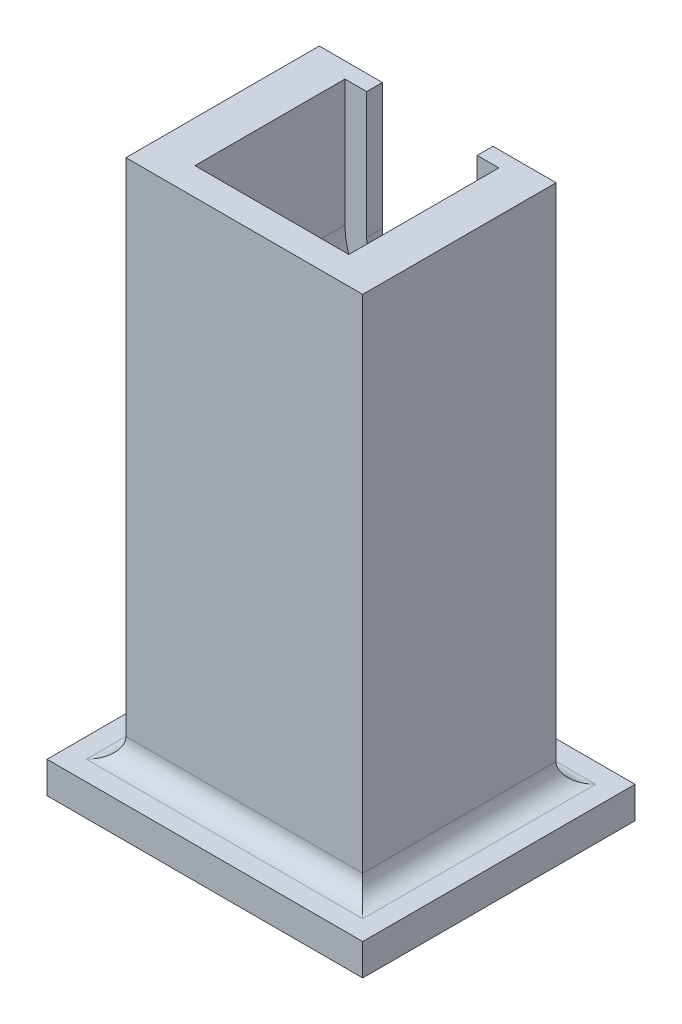
ISO-10303-21;
HEADER;
FILE_DESCRIPTION(('STEP AP214'),'2;1');
FILE_NAME('part.step','',(''),(''),'','','');
FILE_SCHEMA(('AUTOMOTIVE_DESIGN { 1 0 10303 214 1 1 1 1 }'));
ENDSEC;
DATA;
#1=APPLICATION_CONTEXT('core data for automotive mechanical design processes');
#2=APPLICATION_PROTOCOL_DEFINITION('international standard','automotive_design',2000,#1);
#3=PRODUCT_CONTEXT('',#1,'mechanical');
#4=PRODUCT('Part','Part','',(#3));
#5=PRODUCT_RELATED_PRODUCT_CATEGORY('part','',(#4));
#6=PRODUCT_DEFINITION_FORMATION('','',#4);
#7=PRODUCT_DEFINITION_CONTEXT('part definition',#1,'design');
#8=PRODUCT_DEFINITION('design','',#6,#7);
#9=PRODUCT_DEFINITION_SHAPE('','',#8);
#10=(LENGTH_UNIT() NAMED_UNIT(*) SI_UNIT(.MILLI.,.METRE.));
#11=(NAMED_UNIT(*) PLANE_ANGLE_UNIT() SI_UNIT($,.RADIAN.));
#12=(NAMED_UNIT(*) SI_UNIT($,.STERADIAN.) SOLID_ANGLE_UNIT());
#13=UNCERTAINTY_MEASURE_WITH_UNIT(LENGTH_MEASURE(1.E-05),#10,'distance_accuracy_value','');
#14=(GEOMETRIC_REPRESENTATION_CONTEXT(3) GLOBAL_UNCERTAINTY_ASSIGNED_CONTEXT((#13)) GLOBAL_UNIT_ASSIGNED_CONTEXT((#10,
#11,#12)) REPRESENTATION_CONTEXT('',''));
#15=CARTESIAN_POINT('',(0.,0.,0.));
#16=DIRECTION('',(0.,0.,1.));
#17=DIRECTION('',(1.,0.,0.));
#18=AXIS2_PLACEMENT_3D('',#15,#16,#17);
#19=CARTESIAN_POINT('',(0.,0.,38.));
#20=DIRECTION('',(1.,0.,0.));
#21=DIRECTION('',(0.,0.,-1.));
#22=AXIS2_PLACEMENT_3D('',#19,#20,#21);
#23=PLANE('',#22);
#24=DIRECTION('',(0.,1.,0.));
#25=VECTOR('',#24,1.);
#26=CARTESIAN_POINT('',(0.,140.,-4.));
#27=LINE('',#26,#25);
#28=CARTESIAN_POINT('',(0.,13.,-4.));
#29=VERTEX_POINT('',#28);
#30=CARTESIAN_POINT('',(0.,140.,-4.));
#31=VERTEX_POINT('',#30);
#32=EDGE_CURVE('E231',#29,#31,#27,.T.);
#33=ORIENTED_EDGE('',*,*,#32,.F.);
#34=DIRECTION('',(0.,0.,-1.));
#35=VECTOR('',#34,1.);
#36=CARTESIAN_POINT('',(0.,13.,45.));
#37=LINE('',#36,#35);
#38=CARTESIAN_POINT('',(0.,13.,45.));
#39=VERTEX_POINT('',#38);
#40=EDGE_CURVE('E55',#29,#39,#37,.F.);
#41=ORIENTED_EDGE('',*,*,#40,.T.);
#42=DIRECTION('',(0.,-1.,0.));
#43=VECTOR('',#42,1.);
#44=CARTESIAN_POINT('',(0.,140.,45.));
#45=LINE('',#44,#43);
#46=CARTESIAN_POINT('',(0.,140.,45.));
#47=VERTEX_POINT('',#46);
#48=EDGE_CURVE('E282',#47,#39,#45,.T.);
#49=ORIENTED_EDGE('',*,*,#48,.F.);
#50=DIRECTION('',(0.,0.,-1.));
#51=VECTOR('',#50,1.);
#52=CARTESIAN_POINT('',(0.,140.,38.));
#53=LINE('',#52,#51);
#54=EDGE_CURVE('E309',#47,#31,#53,.T.);
#55=ORIENTED_EDGE('',*,*,#54,.T.);
#56=EDGE_LOOP('',(#33,#41,#49,#55));
#57=FACE_BOUND('',#56,.T.);
#58=ADVANCED_FACE('F45',(#57),#23,.F.);
#59=CARTESIAN_POINT('',(60.,0.,38.));
#60=DIRECTION('',(-1.,0.,0.));
#61=DIRECTION('',(0.,0.,1.));
#62=AXIS2_PLACEMENT_3D('',#59,#60,#61);
#63=PLANE('',#62);
#64=DIRECTION('',(0.,1.,0.));
#65=VECTOR('',#64,1.);
#66=CARTESIAN_POINT('',(60.,140.,45.));
#67=LINE('',#66,#65);
#68=CARTESIAN_POINT('',(60.,13.,45.));
#69=VERTEX_POINT('',#68);
#70=CARTESIAN_POINT('',(60.,140.,45.));
#71=VERTEX_POINT('',#70);
#72=EDGE_CURVE('E285',#69,#71,#67,.T.);
#73=ORIENTED_EDGE('',*,*,#72,.F.);
#74=DIRECTION('',(0.,0.,1.));
#75=VECTOR('',#74,1.);
#76=CARTESIAN_POINT('',(60.,13.,-4.));
#77=LINE('',#76,#75);
#78=CARTESIAN_POINT('',(60.,13.,-4.));
#79=VERTEX_POINT('',#78);
#80=EDGE_CURVE('E355',#69,#79,#77,.F.);
#81=ORIENTED_EDGE('',*,*,#80,.T.);
#82=DIRECTION('',(0.,-1.,0.));
#83=VECTOR('',#82,1.);
#84=CARTESIAN_POINT('',(60.,140.,-4.));
#85=LINE('',#84,#83);
#86=CARTESIAN_POINT('',(60.,140.,-4.));
#87=VERTEX_POINT('',#86);
#88=EDGE_CURVE('E228',#87,#79,#85,.T.);
#89=ORIENTED_EDGE('',*,*,#88,.F.);
#90=DIRECTION('',(0.,0.,-1.));
#91=VECTOR('',#90,1.);
#92=CARTESIAN_POINT('',(60.,140.,38.));
#93=LINE('',#92,#91);
#94=EDGE_CURVE('E339',#71,#87,#93,.T.);
#95=ORIENTED_EDGE('',*,*,#94,.F.);
#96=EDGE_LOOP('',(#73,#81,#89,#95));
#97=FACE_BOUND('',#96,.T.);
#98=ADVANCED_FACE('F392',(#97),#63,.F.);
#99=CARTESIAN_POINT('',(0.,0.,45.));
#100=DIRECTION('',(0.,0.,1.));
#101=DIRECTION('',(1.,0.,0.));
#102=AXIS2_PLACEMENT_3D('',#99,#100,#101);
#103=PLANE('',#102);
#104=ORIENTED_EDGE('',*,*,#48,.T.);
#105=DIRECTION('',(1.,0.,0.));
#106=VECTOR('',#105,1.);
#107=CARTESIAN_POINT('',(0.,13.,45.));
#108=LINE('',#107,#106);
#109=EDGE_CURVE('E11',#39,#69,#108,.T.);
#110=ORIENTED_EDGE('',*,*,#109,.T.);
#111=ORIENTED_EDGE('',*,*,#72,.T.);
#112=DIRECTION('',(-1.,0.,0.));
#113=VECTOR('',#112,1.);
#114=CARTESIAN_POINT('',(0.,140.,45.));
#115=LINE('',#114,#113);
#116=EDGE_CURVE('E288',#71,#47,#115,.T.);
#117=ORIENTED_EDGE('',*,*,#116,.T.);
#118=EDGE_LOOP('',(#104,#110,#111,#117));
#119=FACE_BOUND('',#118,.T.);
#120=ADVANCED_FACE('F388',(#119),#103,.T.);
#121=CARTESIAN_POINT('',(30.,108.,-4.));
#122=DIRECTION('',(0.,0.,-1.));
#123=DIRECTION('',(-1.,0.,0.));
#124=AXIS2_PLACEMENT_3D('',#121,#122,#123);
#125=PLANE('',#124);
#126=ORIENTED_EDGE('',*,*,#88,.T.);
#127=DIRECTION('',(-1.,0.,0.));
#128=VECTOR('',#127,1.);
#129=CARTESIAN_POINT('',(30.,13.,-4.));
#130=LINE('',#129,#128);
#131=EDGE_CURVE('E70',#79,#29,#130,.T.);
#132=ORIENTED_EDGE('',*,*,#131,.T.);
#133=ORIENTED_EDGE('',*,*,#32,.T.);
#134=DIRECTION('',(1.,0.,0.));
#135=VECTOR('',#134,1.);
#136=CARTESIAN_POINT('',(16.,140.,-4.));
#137=LINE('',#136,#135);
#138=CARTESIAN_POINT('',(16.,140.,-4.));
#139=VERTEX_POINT('',#138);
#140=EDGE_CURVE('E235',#31,#139,#137,.T.);
#141=ORIENTED_EDGE('',*,*,#140,.T.);
#142=DIRECTION('',(0.,-1.,0.));
#143=VECTOR('',#142,1.);
#144=CARTESIAN_POINT('',(16.,108.,-4.));
#145=LINE('',#144,#143);
#146=CARTESIAN_POINT('',(16.,108.,-4.));
#147=VERTEX_POINT('',#146);
#148=EDGE_CURVE('E238',#139,#147,#145,.T.);
#149=ORIENTED_EDGE('',*,*,#148,.T.);
#150=CARTESIAN_POINT('',(30.,108.,-4.));
#151=DIRECTION('',(0.,0.,1.));
#152=DIRECTION('',(-1.,0.,0.));
#153=AXIS2_PLACEMENT_3D('',#150,#151,#152);
#154=CIRCLE('',#153,14.);
#155=CARTESIAN_POINT('',(44.,108.,-4.));
#156=VERTEX_POINT('',#155);
#157=EDGE_CURVE('E241',#147,#156,#154,.T.);
#158=ORIENTED_EDGE('',*,*,#157,.T.);
#159=DIRECTION('',(0.,1.,0.));
#160=VECTOR('',#159,1.);
#161=CARTESIAN_POINT('',(44.,108.,-4.));
#162=LINE('',#161,#160);
#163=CARTESIAN_POINT('',(44.,140.,-4.));
#164=VERTEX_POINT('',#163);
#165=EDGE_CURVE('E244',#156,#164,#162,.T.);
#166=ORIENTED_EDGE('',*,*,#165,.T.);
#167=DIRECTION('',(1.,0.,0.));
#168=VECTOR('',#167,1.);
#169=CARTESIAN_POINT('',(60.,140.,-4.));
#170=LINE('',#169,#168);
#171=EDGE_CURVE('E247',#164,#87,#170,.T.);
#172=ORIENTED_EDGE('',*,*,#171,.T.);
#173=EDGE_LOOP('',(#126,#132,#133,#141,#149,#158,#166,#172));
#174=FACE_BOUND('',#173,.T.);
#175=ADVANCED_FACE('F516',(#174),#125,.T.);
#176=CARTESIAN_POINT('',(49.5,108.,38.));
#177=DIRECTION('',(1.,0.,0.));
#178=DIRECTION('',(0.,0.,-1.));
#179=AXIS2_PLACEMENT_3D('',#176,#177,#178);
#180=PLANE('',#179);
#181=DIRECTION('',(0.,-1.,0.));
#182=VECTOR('',#181,1.);
#183=CARTESIAN_POINT('',(49.5,108.,0.));
#184=LINE('',#183,#182);
#185=CARTESIAN_POINT('',(49.5,140.,0.));
#186=VERTEX_POINT('',#185);
#187=CARTESIAN_POINT('',(49.5,108.,0.));
#188=VERTEX_POINT('',#187);
#189=EDGE_CURVE('E292',#186,#188,#184,.T.);
#190=ORIENTED_EDGE('',*,*,#189,.T.);
#191=DIRECTION('',(0.,0.,-1.));
#192=VECTOR('',#191,1.);
#193=CARTESIAN_POINT('',(49.5,108.,38.));
#194=LINE('',#193,#192);
#195=CARTESIAN_POINT('',(49.5,108.,38.));
#196=VERTEX_POINT('',#195);
#197=EDGE_CURVE('E331',#196,#188,#194,.T.);
#198=ORIENTED_EDGE('',*,*,#197,.F.);
#199=DIRECTION('',(0.,-1.,0.));
#200=VECTOR('',#199,1.);
#201=CARTESIAN_POINT('',(49.5,108.,38.));
#202=LINE('',#201,#200);
#203=CARTESIAN_POINT('',(49.5,140.,38.));
#204=VERTEX_POINT('',#203);
#205=EDGE_CURVE('E296',#204,#196,#202,.T.);
#206=ORIENTED_EDGE('',*,*,#205,.F.);
#207=DIRECTION('',(0.,0.,-1.));
#208=VECTOR('',#207,1.);
#209=CARTESIAN_POINT('',(49.5,140.,38.));
#210=LINE('',#209,#208);
#211=EDGE_CURVE('E335',#204,#186,#210,.T.);
#212=ORIENTED_EDGE('',*,*,#211,.T.);
#213=EDGE_LOOP('',(#190,#198,#206,#212));
#214=FACE_BOUND('',#213,.T.);
#215=ADVANCED_FACE('F525',(#214),#180,.F.);
#216=CARTESIAN_POINT('',(30.,108.,38.));
#217=DIRECTION('',(0.,0.,-1.));
#218=DIRECTION('',(-1.,0.,0.));
#219=AXIS2_PLACEMENT_3D('',#216,#217,#218);
#220=CYLINDRICAL_SURFACE('',#219,19.5);
#221=CARTESIAN_POINT('',(30.,108.,0.));
#222=DIRECTION('',(0.,0.,-1.));
#223=DIRECTION('',(1.,0.,0.));
#224=AXIS2_PLACEMENT_3D('',#221,#222,#223);
#225=CIRCLE('',#224,19.5);
#226=CARTESIAN_POINT('',(10.5,108.,0.));
#227=VERTEX_POINT('',#226);
#228=EDGE_CURVE('E313',#188,#227,#225,.T.);
#229=ORIENTED_EDGE('',*,*,#228,.T.);
#230=DIRECTION('',(0.,0.,-1.));
#231=VECTOR('',#230,1.);
#232=CARTESIAN_POINT('',(10.5,108.,38.));
#233=LINE('',#232,#231);
#234=CARTESIAN_POINT('',(10.5,108.,38.));
#235=VERTEX_POINT('',#234);
#236=EDGE_CURVE('E327',#235,#227,#233,.T.);
#237=ORIENTED_EDGE('',*,*,#236,.F.);
#238=CARTESIAN_POINT('',(30.,108.,38.));
#239=DIRECTION('',(0.,0.,-1.));
#240=DIRECTION('',(1.,0.,0.));
#241=AXIS2_PLACEMENT_3D('',#238,#239,#240);
#242=CIRCLE('',#241,19.5);
#243=EDGE_CURVE('E300',#196,#235,#242,.T.);
#244=ORIENTED_EDGE('',*,*,#243,.F.);
#245=ORIENTED_EDGE('',*,*,#197,.T.);
#246=EDGE_LOOP('',(#229,#237,#244,#245));
#247=FACE_BOUND('',#246,.T.);
#248=ADVANCED_FACE('F589',(#247),#220,.F.);
#249=CARTESIAN_POINT('',(10.5,108.,38.));
#250=DIRECTION('',(-1.,0.,0.));
#251=DIRECTION('',(0.,0.,1.));
#252=AXIS2_PLACEMENT_3D('',#249,#250,#251);
#253=PLANE('',#252);
#254=DIRECTION('',(0.,1.,0.));
#255=VECTOR('',#254,1.);
#256=CARTESIAN_POINT('',(10.5,108.,0.));
#257=LINE('',#256,#255);
#258=CARTESIAN_POINT('',(10.5,140.,0.));
#259=VERTEX_POINT('',#258);
#260=EDGE_CURVE('E301',#227,#259,#257,.T.);
#261=ORIENTED_EDGE('',*,*,#260,.T.);
#262=DIRECTION('',(0.,0.,-1.));
#263=VECTOR('',#262,1.);
#264=CARTESIAN_POINT('',(10.5,140.,38.));
#265=LINE('',#264,#263);
#266=CARTESIAN_POINT('',(10.5,140.,38.));
#267=VERTEX_POINT('',#266);
#268=EDGE_CURVE('E323',#267,#259,#265,.T.);
#269=ORIENTED_EDGE('',*,*,#268,.F.);
#270=DIRECTION('',(0.,1.,0.));
#271=VECTOR('',#270,1.);
#272=CARTESIAN_POINT('',(10.5,108.,38.));
#273=LINE('',#272,#271);
#274=EDGE_CURVE('E305',#235,#267,#273,.T.);
#275=ORIENTED_EDGE('',*,*,#274,.F.);
#276=ORIENTED_EDGE('',*,*,#236,.T.);
#277=EDGE_LOOP('',(#261,#269,#275,#276));
#278=FACE_BOUND('',#277,.T.);
#279=ADVANCED_FACE('F579',(#278),#253,.F.);
#280=CARTESIAN_POINT('',(0.,140.,38.));
#281=DIRECTION('',(0.,-1.,0.));
#282=DIRECTION('',(1.,0.,0.));
#283=AXIS2_PLACEMENT_3D('',#280,#281,#282);
#284=PLANE('',#283);
#285=ORIENTED_EDGE('',*,*,#268,.T.);
#286=DIRECTION('',(1.,0.,0.));
#287=VECTOR('',#286,1.);
#288=CARTESIAN_POINT('',(16.,140.,0.));
#289=LINE('',#288,#287);
#290=CARTESIAN_POINT('',(16.,140.,0.));
#291=VERTEX_POINT('',#290);
#292=EDGE_CURVE('E222',#259,#291,#289,.T.);
#293=ORIENTED_EDGE('',*,*,#292,.T.);
#294=DIRECTION('',(0.,0.,1.));
#295=VECTOR('',#294,1.);
#296=CARTESIAN_POINT('',(16.,140.,-4.));
#297=LINE('',#296,#295);
#298=EDGE_CURVE('E277',#139,#291,#297,.T.);
#299=ORIENTED_EDGE('',*,*,#298,.F.);
#300=ORIENTED_EDGE('',*,*,#140,.F.);
#301=ORIENTED_EDGE('',*,*,#54,.F.);
#302=ORIENTED_EDGE('',*,*,#116,.F.);
#303=ORIENTED_EDGE('',*,*,#94,.T.);
#304=ORIENTED_EDGE('',*,*,#171,.F.);
#305=DIRECTION('',(0.,0.,1.));
#306=VECTOR('',#305,1.);
#307=CARTESIAN_POINT('',(44.,140.,-4.));
#308=LINE('',#307,#306);
#309=CARTESIAN_POINT('',(44.,140.,0.));
#310=VERTEX_POINT('',#309);
#311=EDGE_CURVE('E251',#164,#310,#308,.T.);
#312=ORIENTED_EDGE('',*,*,#311,.T.);
#313=DIRECTION('',(1.,0.,0.));
#314=VECTOR('',#313,1.);
#315=CARTESIAN_POINT('',(60.,140.,0.));
#316=LINE('',#315,#314);
#317=EDGE_CURVE('E232',#310,#186,#316,.T.);
#318=ORIENTED_EDGE('',*,*,#317,.T.);
#319=ORIENTED_EDGE('',*,*,#211,.F.);
#320=DIRECTION('',(-1.,0.,0.));
#321=VECTOR('',#320,1.);
#322=CARTESIAN_POINT('',(0.,140.,38.));
#323=LINE('',#322,#321);
#324=EDGE_CURVE('E281',#204,#267,#323,.T.);
#325=ORIENTED_EDGE('',*,*,#324,.T.);
#326=EDGE_LOOP('',(#285,#293,#299,#300,#301,#302,#303,#304,#312,#318,#319,#325));
#327=FACE_BOUND('',#326,.T.);
#328=ADVANCED_FACE('F569',(#327),#284,.F.);
#329=CARTESIAN_POINT('',(0.,0.,38.));
#330=DIRECTION('',(0.,0.,1.));
#331=DIRECTION('',(1.,0.,0.));
#332=AXIS2_PLACEMENT_3D('',#329,#330,#331);
#333=PLANE('',#332);
#334=ORIENTED_EDGE('',*,*,#324,.F.);
#335=ORIENTED_EDGE('',*,*,#205,.T.);
#336=ORIENTED_EDGE('',*,*,#243,.T.);
#337=ORIENTED_EDGE('',*,*,#274,.T.);
#338=EDGE_LOOP('',(#334,#335,#336,#337));
#339=FACE_BOUND('',#338,.T.);
#340=ADVANCED_FACE('F560',(#339),#333,.F.);
#341=CARTESIAN_POINT('',(16.,108.,-4.));
#342=DIRECTION('',(-1.,0.,0.));
#343=DIRECTION('',(0.,0.,1.));
#344=AXIS2_PLACEMENT_3D('',#341,#342,#343);
#345=PLANE('',#344);
#346=DIRECTION('',(0.,-1.,0.));
#347=VECTOR('',#346,1.);
#348=CARTESIAN_POINT('',(16.,108.,0.));
#349=LINE('',#348,#347);
#350=CARTESIAN_POINT('',(16.,108.,0.));
#351=VERTEX_POINT('',#350);
#352=EDGE_CURVE('E254',#291,#351,#349,.T.);
#353=ORIENTED_EDGE('',*,*,#352,.T.);
#354=DIRECTION('',(0.,0.,1.));
#355=VECTOR('',#354,1.);
#356=CARTESIAN_POINT('',(16.,108.,-4.));
#357=LINE('',#356,#355);
#358=EDGE_CURVE('E273',#147,#351,#357,.T.);
#359=ORIENTED_EDGE('',*,*,#358,.F.);
#360=ORIENTED_EDGE('',*,*,#148,.F.);
#361=ORIENTED_EDGE('',*,*,#298,.T.);
#362=EDGE_LOOP('',(#353,#359,#360,#361));
#363=FACE_BOUND('',#362,.T.);
#364=ADVANCED_FACE('F551',(#363),#345,.F.);
#365=CARTESIAN_POINT('',(30.,108.,-4.));
#366=DIRECTION('',(0.,0.,1.));
#367=DIRECTION('',(1.,0.,0.));
#368=AXIS2_PLACEMENT_3D('',#365,#366,#367);
#369=CYLINDRICAL_SURFACE('',#368,14.);
#370=CARTESIAN_POINT('',(30.,108.,0.));
#371=DIRECTION('',(0.,0.,1.));
#372=DIRECTION('',(-1.,0.,0.));
#373=AXIS2_PLACEMENT_3D('',#370,#371,#372);
#374=CIRCLE('',#373,14.);
#375=CARTESIAN_POINT('',(44.,108.,0.));
#376=VERTEX_POINT('',#375);
#377=EDGE_CURVE('E257',#351,#376,#374,.T.);
#378=ORIENTED_EDGE('',*,*,#377,.T.);
#379=DIRECTION('',(0.,0.,1.));
#380=VECTOR('',#379,1.);
#381=CARTESIAN_POINT('',(44.,108.,-4.));
#382=LINE('',#381,#380);
#383=EDGE_CURVE('E269',#156,#376,#382,.T.);
#384=ORIENTED_EDGE('',*,*,#383,.F.);
#385=ORIENTED_EDGE('',*,*,#157,.F.);
#386=ORIENTED_EDGE('',*,*,#358,.T.);
#387=EDGE_LOOP('',(#378,#384,#385,#386));
#388=FACE_BOUND('',#387,.T.);
#389=ADVANCED_FACE('F542',(#388),#369,.F.);
#390=CARTESIAN_POINT('',(44.,108.,-4.));
#391=DIRECTION('',(1.,0.,0.));
#392=DIRECTION('',(0.,0.,-1.));
#393=AXIS2_PLACEMENT_3D('',#390,#391,#392);
#394=PLANE('',#393);
#395=DIRECTION('',(0.,1.,0.));
#396=VECTOR('',#395,1.);
#397=CARTESIAN_POINT('',(44.,108.,0.));
#398=LINE('',#397,#396);
#399=EDGE_CURVE('E260',#376,#310,#398,.T.);
#400=ORIENTED_EDGE('',*,*,#399,.T.);
#401=ORIENTED_EDGE('',*,*,#311,.F.);
#402=ORIENTED_EDGE('',*,*,#165,.F.);
#403=ORIENTED_EDGE('',*,*,#383,.T.);
#404=EDGE_LOOP('',(#400,#401,#402,#403));
#405=FACE_BOUND('',#404,.T.);
#406=ADVANCED_FACE('F533',(#405),#394,.F.);
#407=CARTESIAN_POINT('',(30.,108.,0.));
#408=DIRECTION('',(0.,0.,-1.));
#409=DIRECTION('',(-1.,0.,0.));
#410=AXIS2_PLACEMENT_3D('',#407,#408,#409);
#411=PLANE('',#410);
#412=ORIENTED_EDGE('',*,*,#260,.F.);
#413=ORIENTED_EDGE('',*,*,#228,.F.);
#414=ORIENTED_EDGE('',*,*,#189,.F.);
#415=ORIENTED_EDGE('',*,*,#317,.F.);
#416=ORIENTED_EDGE('',*,*,#399,.F.);
#417=ORIENTED_EDGE('',*,*,#377,.F.);
#418=ORIENTED_EDGE('',*,*,#352,.F.);
#419=ORIENTED_EDGE('',*,*,#292,.F.);
#420=EDGE_LOOP('',(#412,#413,#414,#415,#416,#417,#418,#419));
#421=FACE_BOUND('',#420,.T.);
#422=ADVANCED_FACE('F492',(#421),#411,.F.);
#423=CARTESIAN_POINT('',(-10.,8.,55.));
#424=DIRECTION('',(-1.,0.,0.));
#425=DIRECTION('',(0.,0.,1.));
#426=AXIS2_PLACEMENT_3D('',#423,#424,#425);
#427=PLANE('',#426);
#428=DIRECTION('',(0.,0.,-1.));
#429=VECTOR('',#428,1.);
#430=CARTESIAN_POINT('',(-10.,0.,55.));
#431=LINE('',#430,#429);
#432=CARTESIAN_POINT('',(-10.,0.,55.));
#433=VERTEX_POINT('',#432);
#434=CARTESIAN_POINT('',(-9.99999999999999,0.,-14.));
#435=VERTEX_POINT('',#434);
#436=EDGE_CURVE('E212',#433,#435,#431,.T.);
#437=ORIENTED_EDGE('',*,*,#436,.F.);
#438=DIRECTION('',(0.,-1.,0.));
#439=VECTOR('',#438,1.);
#440=CARTESIAN_POINT('',(-10.,8.,55.));
#441=LINE('',#440,#439);
#442=CARTESIAN_POINT('',(-10.,8.,55.));
#443=VERTEX_POINT('',#442);
#444=EDGE_CURVE('E199',#443,#433,#441,.T.);
#445=ORIENTED_EDGE('',*,*,#444,.F.);
#446=DIRECTION('',(0.,0.,-1.));
#447=VECTOR('',#446,1.);
#448=CARTESIAN_POINT('',(-10.,8.,55.));
#449=LINE('',#448,#447);
#450=CARTESIAN_POINT('',(-9.99999999999999,8.,-14.));
#451=VERTEX_POINT('',#450);
#452=EDGE_CURVE('E192',#443,#451,#449,.T.);
#453=ORIENTED_EDGE('',*,*,#452,.T.);
#454=DIRECTION('',(0.,-1.,0.));
#455=VECTOR('',#454,1.);
#456=CARTESIAN_POINT('',(-9.99999999999999,8.,-14.));
#457=LINE('',#456,#455);
#458=EDGE_CURVE('E173',#451,#435,#457,.T.);
#459=ORIENTED_EDGE('',*,*,#458,.T.);
#460=EDGE_LOOP('',(#437,#445,#453,#459));
#461=FACE_BOUND('',#460,.T.);
#462=ADVANCED_FACE('F198',(#461),#427,.T.);
#463=CARTESIAN_POINT('',(-10.,8.,55.));
#464=DIRECTION('',(0.,0.,1.));
#465=DIRECTION('',(1.,0.,0.));
#466=AXIS2_PLACEMENT_3D('',#463,#464,#465);
#467=PLANE('',#466);
#468=DIRECTION('',(-1.,0.,0.));
#469=VECTOR('',#468,1.);
#470=CARTESIAN_POINT('',(-10.,0.,55.));
#471=LINE('',#470,#469);
#472=CARTESIAN_POINT('',(70.,0.,55.));
#473=VERTEX_POINT('',#472);
#474=EDGE_CURVE('E201',#473,#433,#471,.T.);
#475=ORIENTED_EDGE('',*,*,#474,.F.);
#476=DIRECTION('',(0.,-1.,0.));
#477=VECTOR('',#476,1.);
#478=CARTESIAN_POINT('',(70.,8.,55.));
#479=LINE('',#478,#477);
#480=CARTESIAN_POINT('',(70.,8.,55.));
#481=VERTEX_POINT('',#480);
#482=EDGE_CURVE('E223',#481,#473,#479,.T.);
#483=ORIENTED_EDGE('',*,*,#482,.F.);
#484=DIRECTION('',(-1.,0.,0.));
#485=VECTOR('',#484,1.);
#486=CARTESIAN_POINT('',(-10.,8.,55.));
#487=LINE('',#486,#485);
#488=EDGE_CURVE('E185',#481,#443,#487,.T.);
#489=ORIENTED_EDGE('',*,*,#488,.T.);
#490=ORIENTED_EDGE('',*,*,#444,.T.);
#491=EDGE_LOOP('',(#475,#483,#489,#490));
#492=FACE_BOUND('',#491,.T.);
#493=ADVANCED_FACE('F474',(#492),#467,.T.);
#494=CARTESIAN_POINT('',(70.,8.,55.));
#495=DIRECTION('',(1.,0.,0.));
#496=DIRECTION('',(0.,0.,-1.));
#497=AXIS2_PLACEMENT_3D('',#494,#495,#496);
#498=PLANE('',#497);
#499=DIRECTION('',(0.,0.,1.));
#500=VECTOR('',#499,1.);
#501=CARTESIAN_POINT('',(70.,0.,55.));
#502=LINE('',#501,#500);
#503=CARTESIAN_POINT('',(70.,0.,-14.));
#504=VERTEX_POINT('',#503);
#505=EDGE_CURVE('E205',#504,#473,#502,.T.);
#506=ORIENTED_EDGE('',*,*,#505,.F.);
#507=DIRECTION('',(0.,-1.,0.));
#508=VECTOR('',#507,1.);
#509=CARTESIAN_POINT('',(70.,8.,-14.));
#510=LINE('',#509,#508);
#511=CARTESIAN_POINT('',(70.,8.,-14.));
#512=VERTEX_POINT('',#511);
#513=EDGE_CURVE('E184',#512,#504,#510,.T.);
#514=ORIENTED_EDGE('',*,*,#513,.F.);
#515=DIRECTION('',(0.,0.,1.));
#516=VECTOR('',#515,1.);
#517=CARTESIAN_POINT('',(70.,8.,55.));
#518=LINE('',#517,#516);
#519=EDGE_CURVE('E195',#512,#481,#518,.T.);
#520=ORIENTED_EDGE('',*,*,#519,.T.);
#521=ORIENTED_EDGE('',*,*,#482,.T.);
#522=EDGE_LOOP('',(#506,#514,#520,#521));
#523=FACE_BOUND('',#522,.T.);
#524=ADVANCED_FACE('F410',(#523),#498,.T.);
#525=CARTESIAN_POINT('',(-9.99999999999999,8.,-14.));
#526=DIRECTION('',(0.,0.,-1.));
#527=DIRECTION('',(-1.,0.,0.));
#528=AXIS2_PLACEMENT_3D('',#525,#526,#527);
#529=PLANE('',#528);
#530=DIRECTION('',(1.,0.,0.));
#531=VECTOR('',#530,1.);
#532=CARTESIAN_POINT('',(-9.99999999999999,0.,-14.));
#533=LINE('',#532,#531);
#534=EDGE_CURVE('E178',#435,#504,#533,.T.);
#535=ORIENTED_EDGE('',*,*,#534,.F.);
#536=ORIENTED_EDGE('',*,*,#458,.F.);
#537=DIRECTION('',(1.,0.,0.));
#538=VECTOR('',#537,1.);
#539=CARTESIAN_POINT('',(-9.99999999999999,8.,-14.));
#540=LINE('',#539,#538);
#541=EDGE_CURVE('E176',#451,#512,#540,.T.);
#542=ORIENTED_EDGE('',*,*,#541,.T.);
#543=ORIENTED_EDGE('',*,*,#513,.T.);
#544=EDGE_LOOP('',(#535,#536,#542,#543));
#545=FACE_BOUND('',#544,.T.);
#546=ADVANCED_FACE('F175',(#545),#529,.T.);
#547=CARTESIAN_POINT('',(0.,8.,0.));
#548=DIRECTION('',(0.,-1.,0.));
#549=DIRECTION('',(0.,0.,-1.));
#550=AXIS2_PLACEMENT_3D('',#547,#548,#549);
#551=PLANE('',#550);
#552=DIRECTION('',(-1.,0.,0.));
#553=VECTOR('',#552,1.);
#554=CARTESIAN_POINT('',(0.,8.,-9.));
#555=LINE('',#554,#553);
#556=CARTESIAN_POINT('',(-5.,8.,-9.));
#557=VERTEX_POINT('',#556);
#558=CARTESIAN_POINT('',(65.,8.,-9.));
#559=VERTEX_POINT('',#558);
#560=EDGE_CURVE('E348',#557,#559,#555,.F.);
#561=ORIENTED_EDGE('',*,*,#560,.T.);
#562=DIRECTION('',(0.,0.,1.));
#563=VECTOR('',#562,1.);
#564=CARTESIAN_POINT('',(65.,8.,45.));
#565=LINE('',#564,#563);
#566=CARTESIAN_POINT('',(65.,8.,50.));
#567=VERTEX_POINT('',#566);
#568=EDGE_CURVE('E351',#559,#567,#565,.T.);
#569=ORIENTED_EDGE('',*,*,#568,.T.);
#570=DIRECTION('',(1.,0.,0.));
#571=VECTOR('',#570,1.);
#572=CARTESIAN_POINT('',(0.,8.,50.));
#573=LINE('',#572,#571);
#574=CARTESIAN_POINT('',(-5.,8.,50.));
#575=VERTEX_POINT('',#574);
#576=EDGE_CURVE('E342',#567,#575,#573,.F.);
#577=ORIENTED_EDGE('',*,*,#576,.T.);
#578=DIRECTION('',(0.,0.,-1.));
#579=VECTOR('',#578,1.);
#580=CARTESIAN_POINT('',(-5.,8.,-4.));
#581=LINE('',#580,#579);
#582=EDGE_CURVE('E345',#575,#557,#581,.T.);
#583=ORIENTED_EDGE('',*,*,#582,.T.);
#584=EDGE_LOOP('',(#561,#569,#577,#583));
#585=FACE_BOUND('',#584,.T.);
#586=ORIENTED_EDGE('',*,*,#452,.F.);
#587=ORIENTED_EDGE('',*,*,#488,.F.);
#588=ORIENTED_EDGE('',*,*,#519,.F.);
#589=ORIENTED_EDGE('',*,*,#541,.F.);
#590=EDGE_LOOP('',(#586,#587,#588,#589));
#591=FACE_BOUND('',#590,.T.);
#592=ADVANCED_FACE('F190',(#585,#591),#551,.F.);
#593=CARTESIAN_POINT('',(0.,0.,38.));
#594=DIRECTION('',(0.,1.,0.));
#595=DIRECTION('',(0.,0.,1.));
#596=AXIS2_PLACEMENT_3D('',#593,#594,#595);
#597=PLANE('',#596);
#598=ORIENTED_EDGE('',*,*,#436,.T.);
#599=ORIENTED_EDGE('',*,*,#534,.T.);
#600=ORIENTED_EDGE('',*,*,#505,.T.);
#601=ORIENTED_EDGE('',*,*,#474,.T.);
#602=EDGE_LOOP('',(#598,#599,#600,#601));
#603=FACE_BOUND('',#602,.T.);
#604=ADVANCED_FACE('F400',(#603),#597,.F.);
#605=CARTESIAN_POINT('',(-5.,13.,0.));
#606=DIRECTION('',(0.,0.,1.));
#607=DIRECTION('',(1.,0.,0.));
#608=AXIS2_PLACEMENT_3D('',#605,#606,#607);
#609=CYLINDRICAL_SURFACE('',#608,5.);
#610=CARTESIAN_POINT('',(-5.,13.,50.));
#611=DIRECTION('',(0.707106781186547,0.,0.707106781186547));
#612=DIRECTION('',(0.707106781186547,0.,-0.707106781186547));
#613=AXIS2_PLACEMENT_3D('',#610,#611,#612);
#614=ELLIPSE('',#613,7.07106781186547,5.);
#615=EDGE_CURVE('E368',#39,#575,#614,.F.);
#616=ORIENTED_EDGE('',*,*,#615,.F.);
#617=ORIENTED_EDGE('',*,*,#40,.F.);
#618=CARTESIAN_POINT('',(-5.,13.,-9.));
#619=DIRECTION('',(-0.707106781186547,0.,0.707106781186547));
#620=DIRECTION('',(0.707106781186547,0.,0.707106781186547));
#621=AXIS2_PLACEMENT_3D('',#618,#619,#620);
#622=ELLIPSE('',#621,7.07106781186547,5.);
#623=EDGE_CURVE('E49',#557,#29,#622,.T.);
#624=ORIENTED_EDGE('',*,*,#623,.F.);
#625=ORIENTED_EDGE('',*,*,#582,.F.);
#626=EDGE_LOOP('',(#616,#617,#624,#625));
#627=FACE_BOUND('',#626,.T.);
#628=ADVANCED_FACE('F47',(#627),#609,.F.);
#629=CARTESIAN_POINT('',(30.,13.,-9.));
#630=DIRECTION('',(-1.,0.,0.));
#631=DIRECTION('',(0.,0.,1.));
#632=AXIS2_PLACEMENT_3D('',#629,#630,#631);
#633=CYLINDRICAL_SURFACE('',#632,5.);
#634=ORIENTED_EDGE('',*,*,#623,.T.);
#635=ORIENTED_EDGE('',*,*,#131,.F.);
#636=CARTESIAN_POINT('',(65.,13.,-9.));
#637=DIRECTION('',(-0.707106781186547,0.,-0.707106781186547));
#638=DIRECTION('',(-0.707106781186547,0.,0.707106781186547));
#639=AXIS2_PLACEMENT_3D('',#636,#637,#638);
#640=ELLIPSE('',#639,7.07106781186547,5.);
#641=EDGE_CURVE('E366',#559,#79,#640,.T.);
#642=ORIENTED_EDGE('',*,*,#641,.F.);
#643=ORIENTED_EDGE('',*,*,#560,.F.);
#644=EDGE_LOOP('',(#634,#635,#642,#643));
#645=FACE_BOUND('',#644,.T.);
#646=ADVANCED_FACE('F380',(#645),#633,.F.);
#647=CARTESIAN_POINT('',(0.,13.,50.));
#648=DIRECTION('',(1.,0.,0.));
#649=DIRECTION('',(0.,0.,-1.));
#650=AXIS2_PLACEMENT_3D('',#647,#648,#649);
#651=CYLINDRICAL_SURFACE('',#650,5.);
#652=ORIENTED_EDGE('',*,*,#615,.T.);
#653=ORIENTED_EDGE('',*,*,#576,.F.);
#654=CARTESIAN_POINT('',(65.,13.,50.));
#655=DIRECTION('',(0.707106781186547,0.,-0.707106781186547));
#656=DIRECTION('',(0.707106781186547,0.,0.707106781186547));
#657=AXIS2_PLACEMENT_3D('',#654,#655,#656);
#658=ELLIPSE('',#657,7.07106781186547,5.);
#659=EDGE_CURVE('E363',#69,#567,#658,.F.);
#660=ORIENTED_EDGE('',*,*,#659,.F.);
#661=ORIENTED_EDGE('',*,*,#109,.F.);
#662=EDGE_LOOP('',(#652,#653,#660,#661));
#663=FACE_BOUND('',#662,.T.);
#664=ADVANCED_FACE('F385',(#663),#651,.F.);
#665=CARTESIAN_POINT('',(65.,13.,0.));
#666=DIRECTION('',(0.,0.,-1.));
#667=DIRECTION('',(-1.,0.,0.));
#668=AXIS2_PLACEMENT_3D('',#665,#666,#667);
#669=CYLINDRICAL_SURFACE('',#668,5.);
#670=ORIENTED_EDGE('',*,*,#641,.T.);
#671=ORIENTED_EDGE('',*,*,#80,.F.);
#672=ORIENTED_EDGE('',*,*,#659,.T.);
#673=ORIENTED_EDGE('',*,*,#568,.F.);
#674=EDGE_LOOP('',(#670,#671,#672,#673));
#675=FACE_BOUND('',#674,.T.);
#676=ADVANCED_FACE('F396',(#675),#669,.F.);
#677=CLOSED_SHELL('',(#58,#98,#120,#175,#215,#248,#279,#328,#340,#364,#389,#406,#422,#462,#493,
#524,#546,#592,#604,#628,#646,#664,#676));
#678=MANIFOLD_SOLID_BREP('B2',#677);
#679=ADVANCED_BREP_SHAPE_REPRESENTATION('',(#18,#678),#14);
#680=SHAPE_DEFINITION_REPRESENTATION(#9,#679);
ENDSEC;
END-ISO-10303-21;
